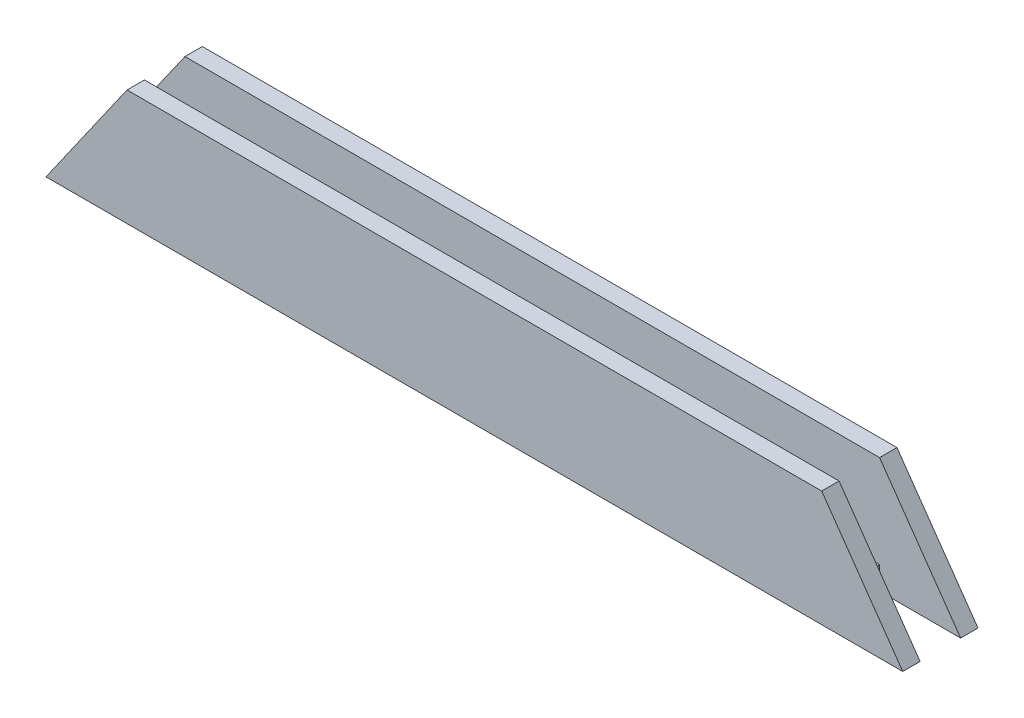
ISO-10303-21;
HEADER;
FILE_DESCRIPTION(('STEP AP214'),'2;1');
FILE_NAME('part.step','',(''),(''),'','','');
FILE_SCHEMA(('AUTOMOTIVE_DESIGN { 1 0 10303 214 1 1 1 1 }'));
ENDSEC;
DATA;
#1=APPLICATION_CONTEXT('core data for automotive mechanical design processes');
#2=APPLICATION_PROTOCOL_DEFINITION('international standard','automotive_design',2000,#1);
#3=PRODUCT_CONTEXT('',#1,'mechanical');
#4=PRODUCT('Part','Part','',(#3));
#5=PRODUCT_RELATED_PRODUCT_CATEGORY('part','',(#4));
#6=PRODUCT_DEFINITION_FORMATION('','',#4);
#7=PRODUCT_DEFINITION_CONTEXT('part definition',#1,'design');
#8=PRODUCT_DEFINITION('design','',#6,#7);
#9=PRODUCT_DEFINITION_SHAPE('','',#8);
#10=(LENGTH_UNIT() NAMED_UNIT(*) SI_UNIT(.MILLI.,.METRE.));
#11=(NAMED_UNIT(*) PLANE_ANGLE_UNIT() SI_UNIT($,.RADIAN.));
#12=(NAMED_UNIT(*) SI_UNIT($,.STERADIAN.) SOLID_ANGLE_UNIT());
#13=UNCERTAINTY_MEASURE_WITH_UNIT(LENGTH_MEASURE(1.E-05),#10,'distance_accuracy_value','');
#14=(GEOMETRIC_REPRESENTATION_CONTEXT(3) GLOBAL_UNCERTAINTY_ASSIGNED_CONTEXT((#13)) GLOBAL_UNIT_ASSIGNED_CONTEXT((#10,
#11,#12)) REPRESENTATION_CONTEXT('',''));
#15=CARTESIAN_POINT('',(0.,0.,0.));
#16=DIRECTION('',(0.,0.,1.));
#17=DIRECTION('',(1.,0.,0.));
#18=AXIS2_PLACEMENT_3D('',#15,#16,#17);
#19=CARTESIAN_POINT('',(0.,0.,0.));
#20=DIRECTION('',(0.,-1.,0.));
#21=DIRECTION('',(0.,0.,-1.));
#22=AXIS2_PLACEMENT_3D('',#19,#20,#21);
#23=PLANE('',#22);
#24=DIRECTION('',(0.,0.,-1.));
#25=VECTOR('',#24,1.);
#26=CARTESIAN_POINT('',(37.,0.,3.25));
#27=LINE('',#26,#25);
#28=CARTESIAN_POINT('',(37.,0.,-1.75));
#29=VERTEX_POINT('',#28);
#30=CARTESIAN_POINT('',(37.,0.,-3.25));
#31=VERTEX_POINT('',#30);
#32=EDGE_CURVE('E51',#29,#31,#27,.T.);
#33=ORIENTED_EDGE('',*,*,#32,.F.);
#34=DIRECTION('',(-1.,0.,0.));
#35=VECTOR('',#34,1.);
#36=CARTESIAN_POINT('',(0.,0.,-1.75));
#37=LINE('',#36,#35);
#38=CARTESIAN_POINT('',(30.,0.,-1.75));
#39=VERTEX_POINT('',#38);
#40=EDGE_CURVE('E453',#29,#39,#37,.T.);
#41=ORIENTED_EDGE('',*,*,#40,.T.);
#42=DIRECTION('',(0.,0.,1.));
#43=VECTOR('',#42,1.);
#44=CARTESIAN_POINT('',(30.,0.,0.));
#45=LINE('',#44,#43);
#46=CARTESIAN_POINT('',(30.,0.,1.75));
#47=VERTEX_POINT('',#46);
#48=EDGE_CURVE('E460',#39,#47,#45,.T.);
#49=ORIENTED_EDGE('',*,*,#48,.T.);
#50=DIRECTION('',(1.,0.,0.));
#51=VECTOR('',#50,1.);
#52=CARTESIAN_POINT('',(0.,0.,1.74999999999999));
#53=LINE('',#52,#51);
#54=CARTESIAN_POINT('',(37.,0.,1.75));
#55=VERTEX_POINT('',#54);
#56=EDGE_CURVE('E150',#47,#55,#53,.T.);
#57=ORIENTED_EDGE('',*,*,#56,.T.);
#58=CARTESIAN_POINT('',(37.,0.,3.25));
#59=VERTEX_POINT('',#58);
#60=EDGE_CURVE('E248',#59,#55,#27,.T.);
#61=ORIENTED_EDGE('',*,*,#60,.F.);
#62=DIRECTION('',(1.,0.,0.));
#63=VECTOR('',#62,1.);
#64=CARTESIAN_POINT('',(-37.,0.,3.25));
#65=LINE('',#64,#63);
#66=CARTESIAN_POINT('',(-37.,0.,3.25));
#67=VERTEX_POINT('',#66);
#68=EDGE_CURVE('E12',#67,#59,#65,.T.);
#69=ORIENTED_EDGE('',*,*,#68,.F.);
#70=DIRECTION('',(0.,0.,1.));
#71=VECTOR('',#70,1.);
#72=CARTESIAN_POINT('',(-37.,0.,3.25));
#73=LINE('',#72,#71);
#74=CARTESIAN_POINT('',(-37.,0.,1.75));
#75=VERTEX_POINT('',#74);
#76=EDGE_CURVE('E267',#75,#67,#73,.T.);
#77=ORIENTED_EDGE('',*,*,#76,.F.);
#78=DIRECTION('',(-1.,0.,0.));
#79=VECTOR('',#78,1.);
#80=CARTESIAN_POINT('',(0.,0.,1.74999999999999));
#81=LINE('',#80,#79);
#82=CARTESIAN_POINT('',(-30.,0.,1.75));
#83=VERTEX_POINT('',#82);
#84=EDGE_CURVE('E199',#83,#75,#81,.T.);
#85=ORIENTED_EDGE('',*,*,#84,.F.);
#86=DIRECTION('',(0.,0.,1.));
#87=VECTOR('',#86,1.);
#88=CARTESIAN_POINT('',(-30.,0.,0.));
#89=LINE('',#88,#87);
#90=CARTESIAN_POINT('',(-30.,0.,-1.75));
#91=VERTEX_POINT('',#90);
#92=EDGE_CURVE('E470',#91,#83,#89,.T.);
#93=ORIENTED_EDGE('',*,*,#92,.F.);
#94=DIRECTION('',(1.,0.,0.));
#95=VECTOR('',#94,1.);
#96=CARTESIAN_POINT('',(0.,0.,-1.75));
#97=LINE('',#96,#95);
#98=CARTESIAN_POINT('',(-37.,0.,-1.75));
#99=VERTEX_POINT('',#98);
#100=EDGE_CURVE('E476',#99,#91,#97,.T.);
#101=ORIENTED_EDGE('',*,*,#100,.F.);
#102=CARTESIAN_POINT('',(-37.,0.,-3.25));
#103=VERTEX_POINT('',#102);
#104=EDGE_CURVE('E58',#103,#99,#73,.T.);
#105=ORIENTED_EDGE('',*,*,#104,.F.);
#106=DIRECTION('',(-1.,0.,0.));
#107=VECTOR('',#106,1.);
#108=CARTESIAN_POINT('',(-37.,0.,-3.25));
#109=LINE('',#108,#107);
#110=EDGE_CURVE('E370',#31,#103,#109,.T.);
#111=ORIENTED_EDGE('',*,*,#110,.F.);
#112=EDGE_LOOP('',(#33,#41,#49,#57,#61,#69,#77,#85,#93,#101,#105,#111));
#113=FACE_BOUND('',#112,.T.);
#114=ADVANCED_FACE('F47',(#113),#23,.T.);
#115=CARTESIAN_POINT('',(24.8322147651007,17.3825503355705,0.));
#116=DIRECTION('',(0.81923192051904,0.573462344363329,0.));
#117=DIRECTION('',(-0.573462344363329,0.81923192051904,0.));
#118=AXIS2_PLACEMENT_3D('',#115,#116,#117);
#119=PLANE('',#118);
#120=DIRECTION('',(0.573462344363329,-0.81923192051904,0.));
#121=VECTOR('',#120,1.);
#122=CARTESIAN_POINT('',(24.8322147651007,17.3825503355705,-1.75));
#123=LINE('',#122,#121);
#124=CARTESIAN_POINT('',(30.,10.,-1.75));
#125=VERTEX_POINT('',#124);
#126=EDGE_CURVE('E176',#125,#29,#123,.T.);
#127=ORIENTED_EDGE('',*,*,#126,.T.);
#128=ORIENTED_EDGE('',*,*,#32,.T.);
#129=DIRECTION('',(0.573462344363329,-0.81923192051904,0.));
#130=VECTOR('',#129,1.);
#131=CARTESIAN_POINT('',(30.,10.,-3.25));
#132=LINE('',#131,#130);
#133=CARTESIAN_POINT('',(30.,10.,-3.25));
#134=VERTEX_POINT('',#133);
#135=EDGE_CURVE('E216',#134,#31,#132,.T.);
#136=ORIENTED_EDGE('',*,*,#135,.F.);
#137=DIRECTION('',(0.,0.,-1.));
#138=VECTOR('',#137,1.);
#139=CARTESIAN_POINT('',(30.,10.,-3.25));
#140=LINE('',#139,#138);
#141=EDGE_CURVE('E164',#125,#134,#140,.T.);
#142=ORIENTED_EDGE('',*,*,#141,.F.);
#143=EDGE_LOOP('',(#127,#128,#136,#142));
#144=FACE_BOUND('',#143,.T.);
#145=ADVANCED_FACE('F230',(#144),#119,.T.);
#146=ORIENTED_EDGE('',*,*,#60,.T.);
#147=DIRECTION('',(0.573462344363329,-0.81923192051904,0.));
#148=VECTOR('',#147,1.);
#149=CARTESIAN_POINT('',(24.8322147651007,17.3825503355705,1.75));
#150=LINE('',#149,#148);
#151=CARTESIAN_POINT('',(30.,10.,1.75));
#152=VERTEX_POINT('',#151);
#153=EDGE_CURVE('E170',#152,#55,#150,.T.);
#154=ORIENTED_EDGE('',*,*,#153,.F.);
#155=CARTESIAN_POINT('',(30.,10.,3.25));
#156=VERTEX_POINT('',#155);
#157=EDGE_CURVE('E168',#156,#152,#140,.T.);
#158=ORIENTED_EDGE('',*,*,#157,.F.);
#159=DIRECTION('',(0.573462344363329,-0.81923192051904,0.));
#160=VECTOR('',#159,1.);
#161=CARTESIAN_POINT('',(30.,10.,3.25));
#162=LINE('',#161,#160);
#163=EDGE_CURVE('E74',#156,#59,#162,.T.);
#164=ORIENTED_EDGE('',*,*,#163,.T.);
#165=EDGE_LOOP('',(#146,#154,#158,#164));
#166=FACE_BOUND('',#165,.T.);
#167=ADVANCED_FACE('F498',(#166),#119,.T.);
#168=CARTESIAN_POINT('',(0.,2.,0.));
#169=DIRECTION('',(0.,-1.,0.));
#170=DIRECTION('',(0.,0.,-1.));
#171=AXIS2_PLACEMENT_3D('',#168,#169,#170);
#172=PLANE('',#171);
#173=DIRECTION('',(0.,0.,-1.));
#174=VECTOR('',#173,1.);
#175=CARTESIAN_POINT('',(30.,2.,1.75));
#176=LINE('',#175,#174);
#177=CARTESIAN_POINT('',(30.,2.,1.75));
#178=VERTEX_POINT('',#177);
#179=CARTESIAN_POINT('',(30.,2.,-1.75));
#180=VERTEX_POINT('',#179);
#181=EDGE_CURVE('E155',#178,#180,#176,.T.);
#182=ORIENTED_EDGE('',*,*,#181,.T.);
#183=DIRECTION('',(-1.,0.,0.));
#184=VECTOR('',#183,1.);
#185=CARTESIAN_POINT('',(0.,2.,-1.75));
#186=LINE('',#185,#184);
#187=CARTESIAN_POINT('',(-30.,2.,-1.75));
#188=VERTEX_POINT('',#187);
#189=EDGE_CURVE('E66',#180,#188,#186,.T.);
#190=ORIENTED_EDGE('',*,*,#189,.T.);
#191=DIRECTION('',(0.,0.,-1.));
#192=VECTOR('',#191,1.);
#193=CARTESIAN_POINT('',(-30.,2.,1.75));
#194=LINE('',#193,#192);
#195=CARTESIAN_POINT('',(-30.,2.,1.75));
#196=VERTEX_POINT('',#195);
#197=EDGE_CURVE('E162',#196,#188,#194,.T.);
#198=ORIENTED_EDGE('',*,*,#197,.F.);
#199=DIRECTION('',(1.,0.,0.));
#200=VECTOR('',#199,1.);
#201=CARTESIAN_POINT('',(0.,2.,1.75));
#202=LINE('',#201,#200);
#203=EDGE_CURVE('E148',#196,#178,#202,.T.);
#204=ORIENTED_EDGE('',*,*,#203,.T.);
#205=EDGE_LOOP('',(#182,#190,#198,#204));
#206=FACE_BOUND('',#205,.T.);
#207=ADVANCED_FACE('F161',(#206),#172,.F.);
#208=CARTESIAN_POINT('',(-24.8322147651007,17.3825503355705,0.));
#209=DIRECTION('',(-0.819231920519041,0.573462344363328,0.));
#210=DIRECTION('',(-0.573462344363328,-0.819231920519041,0.));
#211=AXIS2_PLACEMENT_3D('',#208,#209,#210);
#212=PLANE('',#211);
#213=DIRECTION('',(-0.573462344363328,-0.819231920519041,0.));
#214=VECTOR('',#213,1.);
#215=CARTESIAN_POINT('',(-24.8322147651007,17.3825503355705,1.75));
#216=LINE('',#215,#214);
#217=CARTESIAN_POINT('',(-30.,10.,1.75));
#218=VERTEX_POINT('',#217);
#219=EDGE_CURVE('E179',#218,#75,#216,.T.);
#220=ORIENTED_EDGE('',*,*,#219,.T.);
#221=ORIENTED_EDGE('',*,*,#76,.T.);
#222=DIRECTION('',(-0.573462344363328,-0.819231920519041,0.));
#223=VECTOR('',#222,1.);
#224=CARTESIAN_POINT('',(-30.,10.,3.25));
#225=LINE('',#224,#223);
#226=CARTESIAN_POINT('',(-30.,10.,3.25));
#227=VERTEX_POINT('',#226);
#228=EDGE_CURVE('E372',#227,#67,#225,.T.);
#229=ORIENTED_EDGE('',*,*,#228,.F.);
#230=DIRECTION('',(0.,0.,1.));
#231=VECTOR('',#230,1.);
#232=CARTESIAN_POINT('',(-30.,10.,-3.25));
#233=LINE('',#232,#231);
#234=EDGE_CURVE('E339',#218,#227,#233,.T.);
#235=ORIENTED_EDGE('',*,*,#234,.F.);
#236=EDGE_LOOP('',(#220,#221,#229,#235));
#237=FACE_BOUND('',#236,.T.);
#238=ADVANCED_FACE('F406',(#237),#212,.T.);
#239=CARTESIAN_POINT('',(0.,10.,0.));
#240=DIRECTION('',(0.,1.,0.));
#241=DIRECTION('',(0.,0.,1.));
#242=AXIS2_PLACEMENT_3D('',#239,#240,#241);
#243=PLANE('',#242);
#244=DIRECTION('',(-1.,0.,0.));
#245=VECTOR('',#244,1.);
#246=CARTESIAN_POINT('',(0.,10.,-1.75));
#247=LINE('',#246,#245);
#248=CARTESIAN_POINT('',(-30.,10.,-1.75));
#249=VERTEX_POINT('',#248);
#250=EDGE_CURVE('E182',#125,#249,#247,.T.);
#251=ORIENTED_EDGE('',*,*,#250,.F.);
#252=ORIENTED_EDGE('',*,*,#141,.T.);
#253=DIRECTION('',(-1.,0.,0.));
#254=VECTOR('',#253,1.);
#255=CARTESIAN_POINT('',(-30.,10.,-3.25));
#256=LINE('',#255,#254);
#257=CARTESIAN_POINT('',(-30.,10.,-3.25));
#258=VERTEX_POINT('',#257);
#259=EDGE_CURVE('E211',#134,#258,#256,.T.);
#260=ORIENTED_EDGE('',*,*,#259,.T.);
#261=EDGE_CURVE('E344',#258,#249,#233,.T.);
#262=ORIENTED_EDGE('',*,*,#261,.T.);
#263=EDGE_LOOP('',(#251,#252,#260,#262));
#264=FACE_BOUND('',#263,.T.);
#265=ADVANCED_FACE('F310',(#264),#243,.T.);
#266=DIRECTION('',(1.,0.,0.));
#267=VECTOR('',#266,1.);
#268=CARTESIAN_POINT('',(0.,10.,1.75));
#269=LINE('',#268,#267);
#270=EDGE_CURVE('E186',#218,#152,#269,.T.);
#271=ORIENTED_EDGE('',*,*,#270,.F.);
#272=ORIENTED_EDGE('',*,*,#234,.T.);
#273=DIRECTION('',(1.,0.,0.));
#274=VECTOR('',#273,1.);
#275=CARTESIAN_POINT('',(-30.,10.,3.25));
#276=LINE('',#275,#274);
#277=EDGE_CURVE('E332',#227,#156,#276,.T.);
#278=ORIENTED_EDGE('',*,*,#277,.T.);
#279=ORIENTED_EDGE('',*,*,#157,.T.);
#280=EDGE_LOOP('',(#271,#272,#278,#279));
#281=FACE_BOUND('',#280,.T.);
#282=ADVANCED_FACE('F300',(#281),#243,.T.);
#283=ORIENTED_EDGE('',*,*,#104,.T.);
#284=DIRECTION('',(-0.573462344363328,-0.819231920519041,0.));
#285=VECTOR('',#284,1.);
#286=CARTESIAN_POINT('',(-24.8322147651007,17.3825503355705,-1.75));
#287=LINE('',#286,#285);
#288=EDGE_CURVE('E185',#249,#99,#287,.T.);
#289=ORIENTED_EDGE('',*,*,#288,.F.);
#290=ORIENTED_EDGE('',*,*,#261,.F.);
#291=DIRECTION('',(-0.573462344363328,-0.819231920519041,0.));
#292=VECTOR('',#291,1.);
#293=CARTESIAN_POINT('',(-30.,10.,-3.25));
#294=LINE('',#293,#292);
#295=EDGE_CURVE('E362',#258,#103,#294,.T.);
#296=ORIENTED_EDGE('',*,*,#295,.T.);
#297=EDGE_LOOP('',(#283,#289,#290,#296));
#298=FACE_BOUND('',#297,.T.);
#299=ADVANCED_FACE('F309',(#298),#212,.T.);
#300=CARTESIAN_POINT('',(0.,0.,3.25));
#301=DIRECTION('',(0.,0.,1.));
#302=DIRECTION('',(0.,-1.,0.));
#303=AXIS2_PLACEMENT_3D('',#300,#301,#302);
#304=PLANE('',#303);
#305=ORIENTED_EDGE('',*,*,#228,.T.);
#306=ORIENTED_EDGE('',*,*,#68,.T.);
#307=ORIENTED_EDGE('',*,*,#163,.F.);
#308=ORIENTED_EDGE('',*,*,#277,.F.);
#309=EDGE_LOOP('',(#305,#306,#307,#308));
#310=FACE_BOUND('',#309,.T.);
#311=ADVANCED_FACE('F227',(#310),#304,.T.);
#312=CARTESIAN_POINT('',(0.,0.,-3.25));
#313=DIRECTION('',(0.,0.,-1.));
#314=DIRECTION('',(0.,1.,0.));
#315=AXIS2_PLACEMENT_3D('',#312,#313,#314);
#316=PLANE('',#315);
#317=ORIENTED_EDGE('',*,*,#135,.T.);
#318=ORIENTED_EDGE('',*,*,#110,.T.);
#319=ORIENTED_EDGE('',*,*,#295,.F.);
#320=ORIENTED_EDGE('',*,*,#259,.F.);
#321=EDGE_LOOP('',(#317,#318,#319,#320));
#322=FACE_BOUND('',#321,.T.);
#323=ADVANCED_FACE('F218',(#322),#316,.T.);
#324=CARTESIAN_POINT('',(0.,0.,1.75));
#325=DIRECTION('',(0.,0.,1.));
#326=DIRECTION('',(0.,-1.,0.));
#327=AXIS2_PLACEMENT_3D('',#324,#325,#326);
#328=PLANE('',#327);
#329=ORIENTED_EDGE('',*,*,#219,.F.);
#330=ORIENTED_EDGE('',*,*,#270,.T.);
#331=ORIENTED_EDGE('',*,*,#153,.T.);
#332=ORIENTED_EDGE('',*,*,#56,.F.);
#333=DIRECTION('',(0.,1.,0.));
#334=VECTOR('',#333,1.);
#335=CARTESIAN_POINT('',(30.,-8.,1.75));
#336=LINE('',#335,#334);
#337=EDGE_CURVE('E143',#47,#178,#336,.T.);
#338=ORIENTED_EDGE('',*,*,#337,.T.);
#339=ORIENTED_EDGE('',*,*,#203,.F.);
#340=DIRECTION('',(0.,1.,0.));
#341=VECTOR('',#340,1.);
#342=CARTESIAN_POINT('',(-30.,-8.,1.75));
#343=LINE('',#342,#341);
#344=EDGE_CURVE('E467',#83,#196,#343,.T.);
#345=ORIENTED_EDGE('',*,*,#344,.F.);
#346=ORIENTED_EDGE('',*,*,#84,.T.);
#347=EDGE_LOOP('',(#329,#330,#331,#332,#338,#339,#345,#346));
#348=FACE_BOUND('',#347,.T.);
#349=ADVANCED_FACE('F145',(#348),#328,.F.);
#350=CARTESIAN_POINT('',(0.,0.,-1.75));
#351=DIRECTION('',(0.,0.,-1.));
#352=DIRECTION('',(0.,1.,0.));
#353=AXIS2_PLACEMENT_3D('',#350,#351,#352);
#354=PLANE('',#353);
#355=ORIENTED_EDGE('',*,*,#126,.F.);
#356=ORIENTED_EDGE('',*,*,#250,.T.);
#357=ORIENTED_EDGE('',*,*,#288,.T.);
#358=ORIENTED_EDGE('',*,*,#100,.T.);
#359=DIRECTION('',(0.,1.,0.));
#360=VECTOR('',#359,1.);
#361=CARTESIAN_POINT('',(-30.,-8.,-1.75));
#362=LINE('',#361,#360);
#363=EDGE_CURVE('E458',#91,#188,#362,.T.);
#364=ORIENTED_EDGE('',*,*,#363,.T.);
#365=ORIENTED_EDGE('',*,*,#189,.F.);
#366=DIRECTION('',(0.,1.,0.));
#367=VECTOR('',#366,1.);
#368=CARTESIAN_POINT('',(30.,-8.,-1.75));
#369=LINE('',#368,#367);
#370=EDGE_CURVE('E154',#39,#180,#369,.T.);
#371=ORIENTED_EDGE('',*,*,#370,.F.);
#372=ORIENTED_EDGE('',*,*,#40,.F.);
#373=EDGE_LOOP('',(#355,#356,#357,#358,#364,#365,#371,#372));
#374=FACE_BOUND('',#373,.T.);
#375=ADVANCED_FACE('F312',(#374),#354,.F.);
#376=CARTESIAN_POINT('',(-30.,-8.,1.75));
#377=DIRECTION('',(1.,0.,0.));
#378=DIRECTION('',(0.,0.,-1.));
#379=AXIS2_PLACEMENT_3D('',#376,#377,#378);
#380=PLANE('',#379);
#381=ORIENTED_EDGE('',*,*,#92,.T.);
#382=ORIENTED_EDGE('',*,*,#344,.T.);
#383=ORIENTED_EDGE('',*,*,#197,.T.);
#384=ORIENTED_EDGE('',*,*,#363,.F.);
#385=EDGE_LOOP('',(#381,#382,#383,#384));
#386=FACE_BOUND('',#385,.T.);
#387=ADVANCED_FACE('F485',(#386),#380,.F.);
#388=CARTESIAN_POINT('',(30.,-8.,1.75));
#389=DIRECTION('',(1.,0.,0.));
#390=DIRECTION('',(0.,0.,-1.));
#391=AXIS2_PLACEMENT_3D('',#388,#389,#390);
#392=PLANE('',#391);
#393=ORIENTED_EDGE('',*,*,#370,.T.);
#394=ORIENTED_EDGE('',*,*,#181,.F.);
#395=ORIENTED_EDGE('',*,*,#337,.F.);
#396=ORIENTED_EDGE('',*,*,#48,.F.);
#397=EDGE_LOOP('',(#393,#394,#395,#396));
#398=FACE_BOUND('',#397,.T.);
#399=ADVANCED_FACE('F157',(#398),#392,.T.);
#400=CLOSED_SHELL('',(#114,#145,#167,#207,#238,#265,#282,#299,#311,#323,#349,#375,#387,#399));
#401=MANIFOLD_SOLID_BREP('B2',#400);
#402=ADVANCED_BREP_SHAPE_REPRESENTATION('',(#18,#401),#14);
#403=SHAPE_DEFINITION_REPRESENTATION(#9,#402);
ENDSEC;
END-ISO-10303-21;
